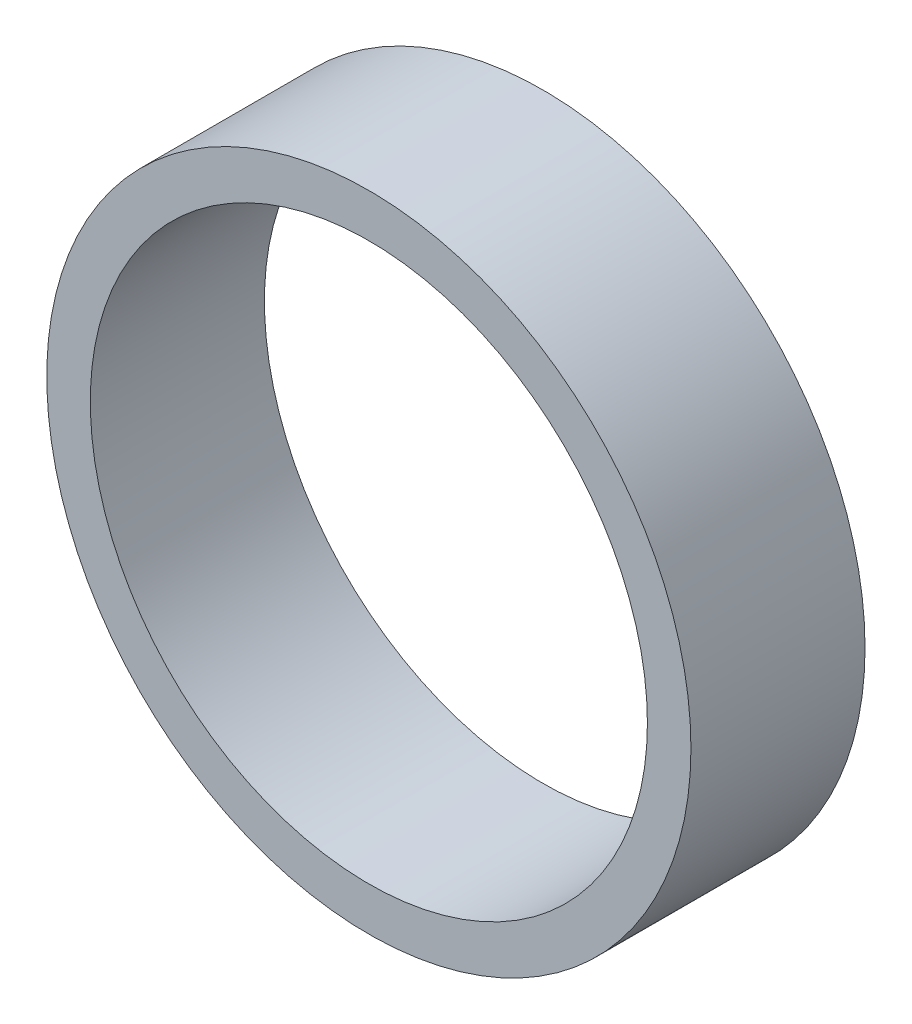
ISO-10303-21;
HEADER;
FILE_DESCRIPTION(('STEP AP214'),'2;1');
FILE_NAME('part.step','',(''),(''),'','','');
FILE_SCHEMA(('AUTOMOTIVE_DESIGN { 1 0 10303 214 1 1 1 1 }'));
ENDSEC;
DATA;
#1=APPLICATION_CONTEXT('core data for automotive mechanical design processes');
#2=APPLICATION_PROTOCOL_DEFINITION('international standard','automotive_design',2000,#1);
#3=PRODUCT_CONTEXT('',#1,'mechanical');
#4=PRODUCT('Part','Part','',(#3));
#5=PRODUCT_RELATED_PRODUCT_CATEGORY('part','',(#4));
#6=PRODUCT_DEFINITION_FORMATION('','',#4);
#7=PRODUCT_DEFINITION_CONTEXT('part definition',#1,'design');
#8=PRODUCT_DEFINITION('design','',#6,#7);
#9=PRODUCT_DEFINITION_SHAPE('','',#8);
#10=(LENGTH_UNIT() NAMED_UNIT(*) SI_UNIT(.MILLI.,.METRE.));
#11=(NAMED_UNIT(*) PLANE_ANGLE_UNIT() SI_UNIT($,.RADIAN.));
#12=(NAMED_UNIT(*) SI_UNIT($,.STERADIAN.) SOLID_ANGLE_UNIT());
#13=UNCERTAINTY_MEASURE_WITH_UNIT(LENGTH_MEASURE(1.E-05),#10,'distance_accuracy_value','');
#14=(GEOMETRIC_REPRESENTATION_CONTEXT(3) GLOBAL_UNCERTAINTY_ASSIGNED_CONTEXT((#13)) GLOBAL_UNIT_ASSIGNED_CONTEXT((#10,
#11,#12)) REPRESENTATION_CONTEXT('',''));
#15=CARTESIAN_POINT('',(0.,0.,0.));
#16=DIRECTION('',(0.,0.,1.));
#17=DIRECTION('',(1.,0.,0.));
#18=AXIS2_PLACEMENT_3D('',#15,#16,#17);
#19=CARTESIAN_POINT('',(15.,0.,6.));
#20=DIRECTION('',(0.,0.,1.));
#21=DIRECTION('',(1.,0.,0.));
#22=AXIS2_PLACEMENT_3D('',#19,#20,#21);
#23=PLANE('',#22);
#24=CARTESIAN_POINT('',(15.,0.,6.));
#25=DIRECTION('',(0.,0.,1.));
#26=DIRECTION('',(1.,0.,0.));
#27=AXIS2_PLACEMENT_3D('',#24,#25,#26);
#28=CIRCLE('',#27,1.85);
#29=CARTESIAN_POINT('',(16.85,0.,6.));
#30=VERTEX_POINT('',#29);
#31=EDGE_CURVE('E10',#30,#30,#28,.T.);
#32=ORIENTED_EDGE('',*,*,#31,.T.);
#33=EDGE_LOOP('',(#32));
#34=FACE_BOUND('',#33,.T.);
#35=CARTESIAN_POINT('',(15.,0.,6.));
#36=DIRECTION('',(0.,0.,1.));
#37=DIRECTION('',(1.,0.,0.));
#38=AXIS2_PLACEMENT_3D('',#35,#36,#37);
#39=CIRCLE('',#38,1.6);
#40=CARTESIAN_POINT('',(16.6,0.,6.));
#41=VERTEX_POINT('',#40);
#42=EDGE_CURVE('E48',#41,#41,#39,.T.);
#43=ORIENTED_EDGE('',*,*,#42,.F.);
#44=EDGE_LOOP('',(#43));
#45=FACE_BOUND('',#44,.T.);
#46=ADVANCED_FACE('F37',(#34,#45),#23,.T.);
#47=CARTESIAN_POINT('',(15.,0.,5.));
#48=DIRECTION('',(0.,0.,1.));
#49=DIRECTION('',(1.,0.,0.));
#50=AXIS2_PLACEMENT_3D('',#47,#48,#49);
#51=PLANE('',#50);
#52=CARTESIAN_POINT('',(15.,0.,5.));
#53=DIRECTION('',(0.,0.,1.));
#54=DIRECTION('',(1.,0.,0.));
#55=AXIS2_PLACEMENT_3D('',#52,#53,#54);
#56=CIRCLE('',#55,1.85);
#57=CARTESIAN_POINT('',(16.85,0.,5.));
#58=VERTEX_POINT('',#57);
#59=EDGE_CURVE('E41',#58,#58,#56,.T.);
#60=ORIENTED_EDGE('',*,*,#59,.F.);
#61=EDGE_LOOP('',(#60));
#62=FACE_BOUND('',#61,.T.);
#63=CARTESIAN_POINT('',(15.,0.,5.));
#64=DIRECTION('',(0.,0.,1.));
#65=DIRECTION('',(1.,0.,0.));
#66=AXIS2_PLACEMENT_3D('',#63,#64,#65);
#67=CIRCLE('',#66,1.6);
#68=CARTESIAN_POINT('',(16.6,0.,5.));
#69=VERTEX_POINT('',#68);
#70=EDGE_CURVE('E50',#69,#69,#67,.T.);
#71=ORIENTED_EDGE('',*,*,#70,.T.);
#72=EDGE_LOOP('',(#71));
#73=FACE_BOUND('',#72,.T.);
#74=ADVANCED_FACE('F60',(#62,#73),#51,.F.);
#75=CARTESIAN_POINT('',(15.,0.,6.));
#76=DIRECTION('',(0.,0.,-1.));
#77=DIRECTION('',(-1.,0.,0.));
#78=AXIS2_PLACEMENT_3D('',#75,#76,#77);
#79=CYLINDRICAL_SURFACE('',#78,1.85);
#80=ORIENTED_EDGE('',*,*,#31,.F.);
#81=EDGE_LOOP('',(#80));
#82=FACE_BOUND('',#81,.T.);
#83=ORIENTED_EDGE('',*,*,#59,.T.);
#84=EDGE_LOOP('',(#83));
#85=FACE_BOUND('',#84,.T.);
#86=ADVANCED_FACE('F39',(#82,#85),#79,.T.);
#87=CARTESIAN_POINT('',(15.,0.,6.));
#88=DIRECTION('',(0.,0.,-1.));
#89=DIRECTION('',(-1.,0.,0.));
#90=AXIS2_PLACEMENT_3D('',#87,#88,#89);
#91=CYLINDRICAL_SURFACE('',#90,1.6);
#92=ORIENTED_EDGE('',*,*,#42,.T.);
#93=EDGE_LOOP('',(#92));
#94=FACE_BOUND('',#93,.T.);
#95=ORIENTED_EDGE('',*,*,#70,.F.);
#96=EDGE_LOOP('',(#95));
#97=FACE_BOUND('',#96,.T.);
#98=ADVANCED_FACE('F56',(#94,#97),#91,.F.);
#99=CLOSED_SHELL('',(#46,#74,#86,#98));
#100=MANIFOLD_SOLID_BREP('B2',#99);
#101=ADVANCED_BREP_SHAPE_REPRESENTATION('',(#18,#100),#14);
#102=SHAPE_DEFINITION_REPRESENTATION(#9,#101);
ENDSEC;
END-ISO-10303-21;
